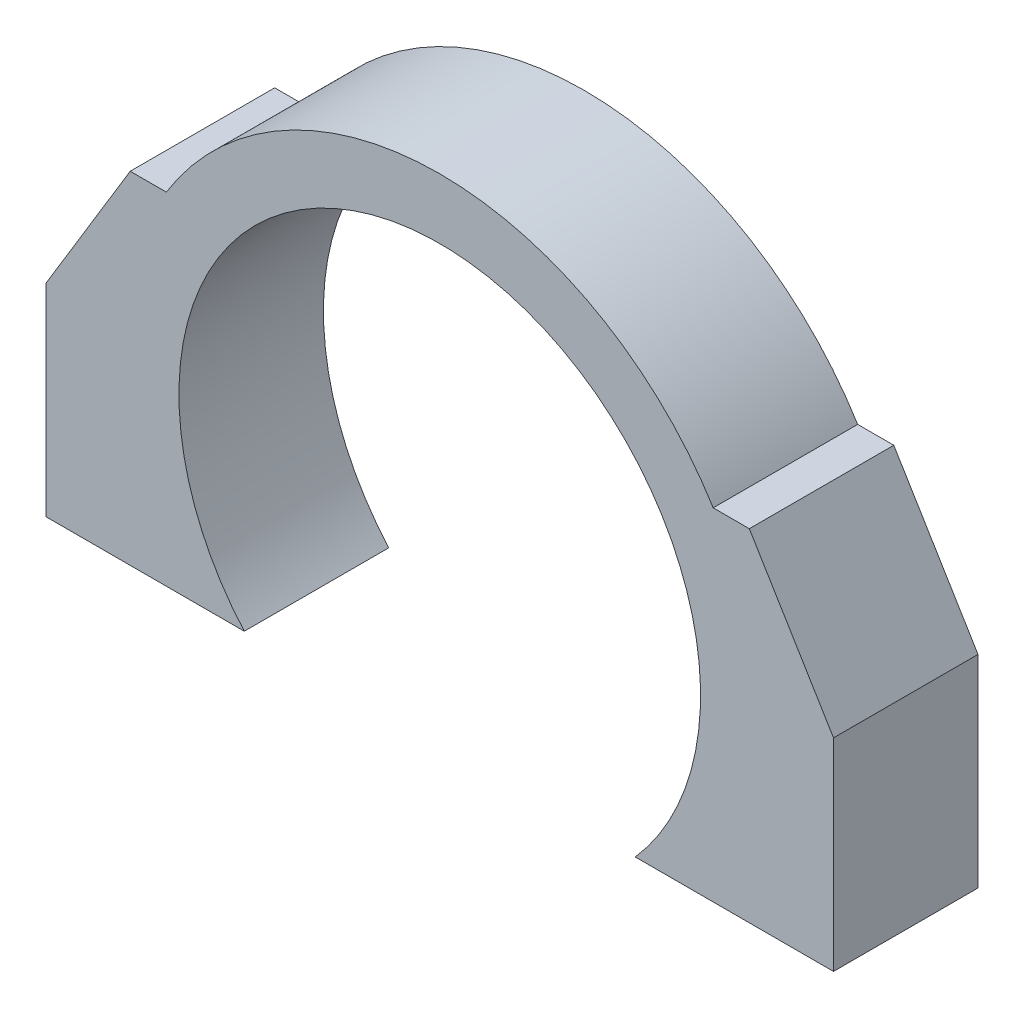
ISO-10303-21;
HEADER;
FILE_DESCRIPTION(('STEP AP214'),'2;1');
FILE_NAME('part.step','',(''),(''),'','','');
FILE_SCHEMA(('AUTOMOTIVE_DESIGN { 1 0 10303 214 1 1 1 1 }'));
ENDSEC;
DATA;
#1=APPLICATION_CONTEXT('core data for automotive mechanical design processes');
#2=APPLICATION_PROTOCOL_DEFINITION('international standard','automotive_design',2000,#1);
#3=PRODUCT_CONTEXT('',#1,'mechanical');
#4=PRODUCT('Part','Part','',(#3));
#5=PRODUCT_RELATED_PRODUCT_CATEGORY('part','',(#4));
#6=PRODUCT_DEFINITION_FORMATION('','',#4);
#7=PRODUCT_DEFINITION_CONTEXT('part definition',#1,'design');
#8=PRODUCT_DEFINITION('design','',#6,#7);
#9=PRODUCT_DEFINITION_SHAPE('','',#8);
#10=(LENGTH_UNIT() NAMED_UNIT(*) SI_UNIT(.MILLI.,.METRE.));
#11=(NAMED_UNIT(*) PLANE_ANGLE_UNIT() SI_UNIT($,.RADIAN.));
#12=(NAMED_UNIT(*) SI_UNIT($,.STERADIAN.) SOLID_ANGLE_UNIT());
#13=UNCERTAINTY_MEASURE_WITH_UNIT(LENGTH_MEASURE(1.E-05),#10,'distance_accuracy_value','');
#14=(GEOMETRIC_REPRESENTATION_CONTEXT(3) GLOBAL_UNCERTAINTY_ASSIGNED_CONTEXT((#13)) GLOBAL_UNIT_ASSIGNED_CONTEXT((#10,
#11,#12)) REPRESENTATION_CONTEXT('',''));
#15=CARTESIAN_POINT('',(0.,0.,0.));
#16=DIRECTION('',(0.,0.,1.));
#17=DIRECTION('',(1.,0.,0.));
#18=AXIS2_PLACEMENT_3D('',#15,#16,#17);
#19=CARTESIAN_POINT('',(0.,23.9,20.));
#20=DIRECTION('',(0.,0.,-1.));
#21=DIRECTION('',(-1.,0.,0.));
#22=AXIS2_PLACEMENT_3D('',#19,#20,#21);
#23=CYLINDRICAL_SURFACE('',#22,36.1);
#24=CARTESIAN_POINT('',(0.,23.9,0.));
#25=DIRECTION('',(0.,0.,-1.));
#26=DIRECTION('',(-1.,0.,0.));
#27=AXIS2_PLACEMENT_3D('',#24,#25,#26);
#28=CIRCLE('',#27,36.1);
#29=CARTESIAN_POINT('',(-27.0554985169374,0.,0.));
#30=VERTEX_POINT('',#29);
#31=CARTESIAN_POINT('',(27.0554985169374,0.,0.));
#32=VERTEX_POINT('',#31);
#33=EDGE_CURVE('E145',#30,#32,#28,.T.);
#34=ORIENTED_EDGE('',*,*,#33,.T.);
#35=DIRECTION('',(0.,0.,-1.));
#36=VECTOR('',#35,1.);
#37=CARTESIAN_POINT('',(27.0554985169374,0.,20.));
#38=LINE('',#37,#36);
#39=CARTESIAN_POINT('',(27.0554985169374,0.,20.));
#40=VERTEX_POINT('',#39);
#41=EDGE_CURVE('E11',#40,#32,#38,.T.);
#42=ORIENTED_EDGE('',*,*,#41,.F.);
#43=CARTESIAN_POINT('',(0.,23.9,20.));
#44=DIRECTION('',(0.,0.,-1.));
#45=DIRECTION('',(-1.,0.,0.));
#46=AXIS2_PLACEMENT_3D('',#43,#44,#45);
#47=CIRCLE('',#46,36.1);
#48=CARTESIAN_POINT('',(-27.0554985169374,0.,20.));
#49=VERTEX_POINT('',#48);
#50=EDGE_CURVE('E163',#49,#40,#47,.T.);
#51=ORIENTED_EDGE('',*,*,#50,.F.);
#52=DIRECTION('',(0.,0.,-1.));
#53=VECTOR('',#52,1.);
#54=CARTESIAN_POINT('',(-27.0554985169374,0.,20.));
#55=LINE('',#54,#53);
#56=EDGE_CURVE('E141',#49,#30,#55,.T.);
#57=ORIENTED_EDGE('',*,*,#56,.T.);
#58=EDGE_LOOP('',(#34,#42,#51,#57));
#59=FACE_BOUND('',#58,.T.);
#60=ADVANCED_FACE('F37',(#59),#23,.F.);
#61=CARTESIAN_POINT('',(27.0554985169374,0.,20.));
#62=DIRECTION('',(0.,1.,0.));
#63=DIRECTION('',(-1.,0.,0.));
#64=AXIS2_PLACEMENT_3D('',#61,#62,#63);
#65=PLANE('',#64);
#66=DIRECTION('',(1.,0.,0.));
#67=VECTOR('',#66,1.);
#68=CARTESIAN_POINT('',(27.0554985169374,0.,0.));
#69=LINE('',#68,#67);
#70=CARTESIAN_POINT('',(54.5,0.,0.));
#71=VERTEX_POINT('',#70);
#72=EDGE_CURVE('E148',#32,#71,#69,.T.);
#73=ORIENTED_EDGE('',*,*,#72,.T.);
#74=DIRECTION('',(0.,0.,-1.));
#75=VECTOR('',#74,1.);
#76=CARTESIAN_POINT('',(54.5,0.,20.));
#77=LINE('',#76,#75);
#78=CARTESIAN_POINT('',(54.5,0.,20.));
#79=VERTEX_POINT('',#78);
#80=EDGE_CURVE('E45',#79,#71,#77,.T.);
#81=ORIENTED_EDGE('',*,*,#80,.F.);
#82=DIRECTION('',(1.,0.,0.));
#83=VECTOR('',#82,1.);
#84=CARTESIAN_POINT('',(27.0554985169374,0.,20.));
#85=LINE('',#84,#83);
#86=EDGE_CURVE('E102',#40,#79,#85,.T.);
#87=ORIENTED_EDGE('',*,*,#86,.F.);
#88=ORIENTED_EDGE('',*,*,#41,.T.);
#89=EDGE_LOOP('',(#73,#81,#87,#88));
#90=FACE_BOUND('',#89,.T.);
#91=ADVANCED_FACE('F212',(#90),#65,.F.);
#92=CARTESIAN_POINT('',(54.5,0.,20.));
#93=DIRECTION('',(-1.,0.,0.));
#94=DIRECTION('',(0.,0.,1.));
#95=AXIS2_PLACEMENT_3D('',#92,#93,#94);
#96=PLANE('',#95);
#97=DIRECTION('',(0.,1.,0.));
#98=VECTOR('',#97,1.);
#99=CARTESIAN_POINT('',(54.5,0.,0.));
#100=LINE('',#99,#98);
#101=CARTESIAN_POINT('',(54.5,28.,0.));
#102=VERTEX_POINT('',#101);
#103=EDGE_CURVE('E150',#71,#102,#100,.T.);
#104=ORIENTED_EDGE('',*,*,#103,.T.);
#105=DIRECTION('',(0.,0.,-1.));
#106=VECTOR('',#105,1.);
#107=CARTESIAN_POINT('',(54.5,28.,20.));
#108=LINE('',#107,#106);
#109=CARTESIAN_POINT('',(54.5,28.,20.));
#110=VERTEX_POINT('',#109);
#111=EDGE_CURVE('E176',#110,#102,#108,.T.);
#112=ORIENTED_EDGE('',*,*,#111,.F.);
#113=DIRECTION('',(0.,1.,0.));
#114=VECTOR('',#113,1.);
#115=CARTESIAN_POINT('',(54.5,0.,20.));
#116=LINE('',#115,#114);
#117=EDGE_CURVE('E184',#79,#110,#116,.T.);
#118=ORIENTED_EDGE('',*,*,#117,.F.);
#119=ORIENTED_EDGE('',*,*,#80,.T.);
#120=EDGE_LOOP('',(#104,#112,#118,#119));
#121=FACE_BOUND('',#120,.T.);
#122=ADVANCED_FACE('F182',(#121),#96,.F.);
#123=CARTESIAN_POINT('',(42.8464898152652,47.2457480053563,20.));
#124=DIRECTION('',(-0.855406188749786,-0.517957770719356,0.));
#125=DIRECTION('',(0.517957770719356,-0.855406188749786,0.));
#126=AXIS2_PLACEMENT_3D('',#123,#124,#125);
#127=PLANE('',#126);
#128=DIRECTION('',(-0.517957770719356,0.855406188749786,0.));
#129=VECTOR('',#128,1.);
#130=CARTESIAN_POINT('',(42.8464898152652,47.2457480053563,0.));
#131=LINE('',#130,#129);
#132=CARTESIAN_POINT('',(42.8464898152652,47.2457480053563,0.));
#133=VERTEX_POINT('',#132);
#134=EDGE_CURVE('E152',#102,#133,#131,.T.);
#135=ORIENTED_EDGE('',*,*,#134,.T.);
#136=DIRECTION('',(0.,0.,-1.));
#137=VECTOR('',#136,1.);
#138=CARTESIAN_POINT('',(42.8464898152652,47.2457480053563,20.));
#139=LINE('',#138,#137);
#140=CARTESIAN_POINT('',(42.8464898152652,47.2457480053563,20.));
#141=VERTEX_POINT('',#140);
#142=EDGE_CURVE('E173',#141,#133,#139,.T.);
#143=ORIENTED_EDGE('',*,*,#142,.F.);
#144=DIRECTION('',(-0.517957770719356,0.855406188749786,0.));
#145=VECTOR('',#144,1.);
#146=CARTESIAN_POINT('',(42.8464898152652,47.2457480053563,20.));
#147=LINE('',#146,#145);
#148=EDGE_CURVE('E202',#110,#141,#147,.T.);
#149=ORIENTED_EDGE('',*,*,#148,.F.);
#150=ORIENTED_EDGE('',*,*,#111,.T.);
#151=EDGE_LOOP('',(#135,#143,#149,#150));
#152=FACE_BOUND('',#151,.T.);
#153=ADVANCED_FACE('F193',(#152),#127,.F.);
#154=CARTESIAN_POINT('',(42.8464898152652,47.2457480053563,20.));
#155=DIRECTION('',(0.,-1.,0.));
#156=DIRECTION('',(0.,0.,-1.));
#157=AXIS2_PLACEMENT_3D('',#154,#155,#156);
#158=PLANE('',#157);
#159=DIRECTION('',(-1.,0.,0.));
#160=VECTOR('',#159,1.);
#161=CARTESIAN_POINT('',(42.8464898152652,47.2457480053563,0.));
#162=LINE('',#161,#160);
#163=CARTESIAN_POINT('',(37.8464898152652,47.2457480053563,0.));
#164=VERTEX_POINT('',#163);
#165=EDGE_CURVE('E154',#133,#164,#162,.T.);
#166=ORIENTED_EDGE('',*,*,#165,.T.);
#167=DIRECTION('',(0.,0.,-1.));
#168=VECTOR('',#167,1.);
#169=CARTESIAN_POINT('',(37.8464898152652,47.2457480053563,20.));
#170=LINE('',#169,#168);
#171=CARTESIAN_POINT('',(37.8464898152652,47.2457480053563,20.));
#172=VERTEX_POINT('',#171);
#173=EDGE_CURVE('E170',#172,#164,#170,.T.);
#174=ORIENTED_EDGE('',*,*,#173,.F.);
#175=DIRECTION('',(-1.,0.,0.));
#176=VECTOR('',#175,1.);
#177=CARTESIAN_POINT('',(42.8464898152652,47.2457480053563,20.));
#178=LINE('',#177,#176);
#179=EDGE_CURVE('E199',#141,#172,#178,.T.);
#180=ORIENTED_EDGE('',*,*,#179,.F.);
#181=ORIENTED_EDGE('',*,*,#142,.T.);
#182=EDGE_LOOP('',(#166,#174,#180,#181));
#183=FACE_BOUND('',#182,.T.);
#184=ADVANCED_FACE('F197',(#183),#158,.F.);
#185=CARTESIAN_POINT('',(0.,23.9,20.));
#186=DIRECTION('',(0.,0.,-1.));
#187=DIRECTION('',(-1.,0.,0.));
#188=AXIS2_PLACEMENT_3D('',#185,#186,#187);
#189=CYLINDRICAL_SURFACE('',#188,44.4677494513335);
#190=CARTESIAN_POINT('',(0.,23.9,0.));
#191=DIRECTION('',(0.,0.,1.));
#192=DIRECTION('',(-1.,0.,0.));
#193=AXIS2_PLACEMENT_3D('',#190,#191,#192);
#194=CIRCLE('',#193,44.4677494513335);
#195=CARTESIAN_POINT('',(-37.8464898152652,47.2457480053563,0.));
#196=VERTEX_POINT('',#195);
#197=EDGE_CURVE('E156',#164,#196,#194,.T.);
#198=ORIENTED_EDGE('',*,*,#197,.T.);
#199=DIRECTION('',(0.,0.,-1.));
#200=VECTOR('',#199,1.);
#201=CARTESIAN_POINT('',(-37.8464898152652,47.2457480053563,20.));
#202=LINE('',#201,#200);
#203=CARTESIAN_POINT('',(-37.8464898152652,47.2457480053563,20.));
#204=VERTEX_POINT('',#203);
#205=EDGE_CURVE('E167',#204,#196,#202,.T.);
#206=ORIENTED_EDGE('',*,*,#205,.F.);
#207=CARTESIAN_POINT('',(0.,23.9,20.));
#208=DIRECTION('',(0.,0.,1.));
#209=DIRECTION('',(-1.,0.,0.));
#210=AXIS2_PLACEMENT_3D('',#207,#208,#209);
#211=CIRCLE('',#210,44.4677494513335);
#212=EDGE_CURVE('E201',#172,#204,#211,.T.);
#213=ORIENTED_EDGE('',*,*,#212,.F.);
#214=ORIENTED_EDGE('',*,*,#173,.T.);
#215=EDGE_LOOP('',(#198,#206,#213,#214));
#216=FACE_BOUND('',#215,.T.);
#217=ADVANCED_FACE('F224',(#216),#189,.T.);
#218=CARTESIAN_POINT('',(-42.8464898152652,47.2457480053563,20.));
#219=DIRECTION('',(0.,-1.,0.));
#220=DIRECTION('',(0.,0.,-1.));
#221=AXIS2_PLACEMENT_3D('',#218,#219,#220);
#222=PLANE('',#221);
#223=DIRECTION('',(-1.,0.,0.));
#224=VECTOR('',#223,1.);
#225=CARTESIAN_POINT('',(-42.8464898152652,47.2457480053563,0.));
#226=LINE('',#225,#224);
#227=CARTESIAN_POINT('',(-42.8464898152652,47.2457480053563,0.));
#228=VERTEX_POINT('',#227);
#229=EDGE_CURVE('E158',#196,#228,#226,.T.);
#230=ORIENTED_EDGE('',*,*,#229,.T.);
#231=DIRECTION('',(0.,0.,-1.));
#232=VECTOR('',#231,1.);
#233=CARTESIAN_POINT('',(-42.8464898152652,47.2457480053563,20.));
#234=LINE('',#233,#232);
#235=CARTESIAN_POINT('',(-42.8464898152652,47.2457480053563,20.));
#236=VERTEX_POINT('',#235);
#237=EDGE_CURVE('E136',#236,#228,#234,.T.);
#238=ORIENTED_EDGE('',*,*,#237,.F.);
#239=DIRECTION('',(-1.,0.,0.));
#240=VECTOR('',#239,1.);
#241=CARTESIAN_POINT('',(-42.8464898152652,47.2457480053563,20.));
#242=LINE('',#241,#240);
#243=EDGE_CURVE('E127',#204,#236,#242,.T.);
#244=ORIENTED_EDGE('',*,*,#243,.F.);
#245=ORIENTED_EDGE('',*,*,#205,.T.);
#246=EDGE_LOOP('',(#230,#238,#244,#245));
#247=FACE_BOUND('',#246,.T.);
#248=ADVANCED_FACE('F227',(#247),#222,.F.);
#249=CARTESIAN_POINT('',(-42.8464898152652,47.2457480053563,20.));
#250=DIRECTION('',(0.855406188749786,-0.517957770719356,0.));
#251=DIRECTION('',(0.517957770719356,0.855406188749786,0.));
#252=AXIS2_PLACEMENT_3D('',#249,#250,#251);
#253=PLANE('',#252);
#254=DIRECTION('',(-0.517957770719356,-0.855406188749786,0.));
#255=VECTOR('',#254,1.);
#256=CARTESIAN_POINT('',(-42.8464898152652,47.2457480053563,0.));
#257=LINE('',#256,#255);
#258=CARTESIAN_POINT('',(-54.5,28.,0.));
#259=VERTEX_POINT('',#258);
#260=EDGE_CURVE('E135',#228,#259,#257,.T.);
#261=ORIENTED_EDGE('',*,*,#260,.T.);
#262=DIRECTION('',(0.,0.,-1.));
#263=VECTOR('',#262,1.);
#264=CARTESIAN_POINT('',(-54.5,28.,20.));
#265=LINE('',#264,#263);
#266=CARTESIAN_POINT('',(-54.5,28.,20.));
#267=VERTEX_POINT('',#266);
#268=EDGE_CURVE('E132',#267,#259,#265,.T.);
#269=ORIENTED_EDGE('',*,*,#268,.F.);
#270=DIRECTION('',(-0.517957770719356,-0.855406188749786,0.));
#271=VECTOR('',#270,1.);
#272=CARTESIAN_POINT('',(-42.8464898152652,47.2457480053563,20.));
#273=LINE('',#272,#271);
#274=EDGE_CURVE('E121',#236,#267,#273,.T.);
#275=ORIENTED_EDGE('',*,*,#274,.F.);
#276=ORIENTED_EDGE('',*,*,#237,.T.);
#277=EDGE_LOOP('',(#261,#269,#275,#276));
#278=FACE_BOUND('',#277,.T.);
#279=ADVANCED_FACE('F133',(#278),#253,.F.);
#280=CARTESIAN_POINT('',(-54.5,0.,20.));
#281=DIRECTION('',(1.,0.,0.));
#282=DIRECTION('',(0.,0.,-1.));
#283=AXIS2_PLACEMENT_3D('',#280,#281,#282);
#284=PLANE('',#283);
#285=DIRECTION('',(0.,-1.,0.));
#286=VECTOR('',#285,1.);
#287=CARTESIAN_POINT('',(-54.5,0.,0.));
#288=LINE('',#287,#286);
#289=CARTESIAN_POINT('',(-54.5,0.,0.));
#290=VERTEX_POINT('',#289);
#291=EDGE_CURVE('E88',#259,#290,#288,.T.);
#292=ORIENTED_EDGE('',*,*,#291,.T.);
#293=DIRECTION('',(0.,0.,-1.));
#294=VECTOR('',#293,1.);
#295=CARTESIAN_POINT('',(-54.5,0.,20.));
#296=LINE('',#295,#294);
#297=CARTESIAN_POINT('',(-54.5,0.,20.));
#298=VERTEX_POINT('',#297);
#299=EDGE_CURVE('E137',#298,#290,#296,.T.);
#300=ORIENTED_EDGE('',*,*,#299,.F.);
#301=DIRECTION('',(0.,-1.,0.));
#302=VECTOR('',#301,1.);
#303=CARTESIAN_POINT('',(-54.5,0.,20.));
#304=LINE('',#303,#302);
#305=EDGE_CURVE('E125',#267,#298,#304,.T.);
#306=ORIENTED_EDGE('',*,*,#305,.F.);
#307=ORIENTED_EDGE('',*,*,#268,.T.);
#308=EDGE_LOOP('',(#292,#300,#306,#307));
#309=FACE_BOUND('',#308,.T.);
#310=ADVANCED_FACE('F139',(#309),#284,.F.);
#311=CARTESIAN_POINT('',(-27.0554985169374,0.,20.));
#312=DIRECTION('',(0.,1.,0.));
#313=DIRECTION('',(-1.,0.,0.));
#314=AXIS2_PLACEMENT_3D('',#311,#312,#313);
#315=PLANE('',#314);
#316=DIRECTION('',(1.,0.,0.));
#317=VECTOR('',#316,1.);
#318=CARTESIAN_POINT('',(-27.0554985169374,0.,0.));
#319=LINE('',#318,#317);
#320=EDGE_CURVE('E94',#290,#30,#319,.T.);
#321=ORIENTED_EDGE('',*,*,#320,.T.);
#322=ORIENTED_EDGE('',*,*,#56,.F.);
#323=DIRECTION('',(1.,0.,0.));
#324=VECTOR('',#323,1.);
#325=CARTESIAN_POINT('',(-27.0554985169374,0.,20.));
#326=LINE('',#325,#324);
#327=EDGE_CURVE('E53',#298,#49,#326,.T.);
#328=ORIENTED_EDGE('',*,*,#327,.F.);
#329=ORIENTED_EDGE('',*,*,#299,.T.);
#330=EDGE_LOOP('',(#321,#322,#328,#329));
#331=FACE_BOUND('',#330,.T.);
#332=ADVANCED_FACE('F236',(#331),#315,.F.);
#333=CARTESIAN_POINT('',(0.,23.9,20.));
#334=DIRECTION('',(0.,0.,-1.));
#335=DIRECTION('',(-1.,0.,0.));
#336=AXIS2_PLACEMENT_3D('',#333,#334,#335);
#337=PLANE('',#336);
#338=ORIENTED_EDGE('',*,*,#50,.T.);
#339=ORIENTED_EDGE('',*,*,#86,.T.);
#340=ORIENTED_EDGE('',*,*,#117,.T.);
#341=ORIENTED_EDGE('',*,*,#148,.T.);
#342=ORIENTED_EDGE('',*,*,#179,.T.);
#343=ORIENTED_EDGE('',*,*,#212,.T.);
#344=ORIENTED_EDGE('',*,*,#243,.T.);
#345=ORIENTED_EDGE('',*,*,#274,.T.);
#346=ORIENTED_EDGE('',*,*,#305,.T.);
#347=ORIENTED_EDGE('',*,*,#327,.T.);
#348=EDGE_LOOP('',(#338,#339,#340,#341,#342,#343,#344,#345,#346,#347));
#349=FACE_BOUND('',#348,.T.);
#350=ADVANCED_FACE('F123',(#349),#337,.F.);
#351=CARTESIAN_POINT('',(0.,23.9,0.));
#352=DIRECTION('',(0.,0.,-1.));
#353=DIRECTION('',(-1.,0.,0.));
#354=AXIS2_PLACEMENT_3D('',#351,#352,#353);
#355=PLANE('',#354);
#356=ORIENTED_EDGE('',*,*,#33,.F.);
#357=ORIENTED_EDGE('',*,*,#320,.F.);
#358=ORIENTED_EDGE('',*,*,#291,.F.);
#359=ORIENTED_EDGE('',*,*,#260,.F.);
#360=ORIENTED_EDGE('',*,*,#229,.F.);
#361=ORIENTED_EDGE('',*,*,#197,.F.);
#362=ORIENTED_EDGE('',*,*,#165,.F.);
#363=ORIENTED_EDGE('',*,*,#134,.F.);
#364=ORIENTED_EDGE('',*,*,#103,.F.);
#365=ORIENTED_EDGE('',*,*,#72,.F.);
#366=EDGE_LOOP('',(#356,#357,#358,#359,#360,#361,#362,#363,#364,#365));
#367=FACE_BOUND('',#366,.T.);
#368=ADVANCED_FACE('F188',(#367),#355,.T.);
#369=CLOSED_SHELL('',(#60,#91,#122,#153,#184,#217,#248,#279,#310,#332,#350,#368));
#370=MANIFOLD_SOLID_BREP('B2',#369);
#371=ADVANCED_BREP_SHAPE_REPRESENTATION('',(#18,#370),#14);
#372=SHAPE_DEFINITION_REPRESENTATION(#9,#371);
ENDSEC;
END-ISO-10303-21;
